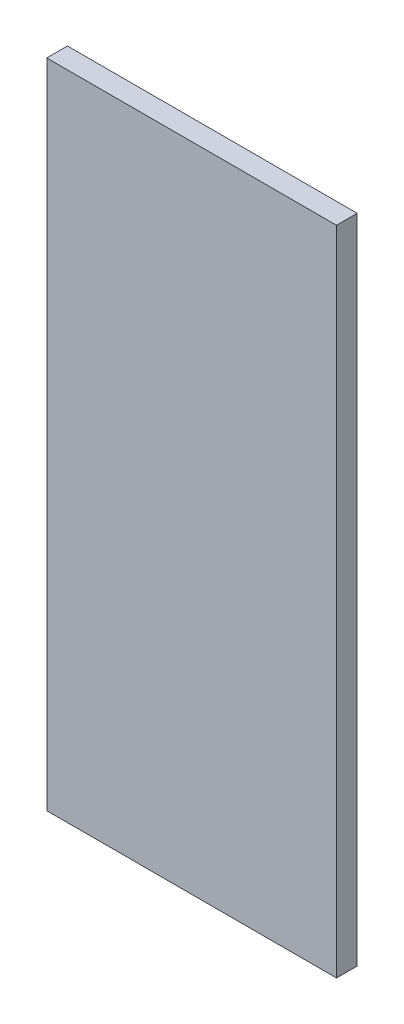
ISO-10303-21;
HEADER;
FILE_DESCRIPTION(('STEP AP214'),'2;1');
FILE_NAME('part.step','',(''),(''),'','','');
FILE_SCHEMA(('AUTOMOTIVE_DESIGN { 1 0 10303 214 1 1 1 1 }'));
ENDSEC;
DATA;
#1=APPLICATION_CONTEXT('core data for automotive mechanical design processes');
#2=APPLICATION_PROTOCOL_DEFINITION('international standard','automotive_design',2000,#1);
#3=PRODUCT_CONTEXT('',#1,'mechanical');
#4=PRODUCT('Part','Part','',(#3));
#5=PRODUCT_RELATED_PRODUCT_CATEGORY('part','',(#4));
#6=PRODUCT_DEFINITION_FORMATION('','',#4);
#7=PRODUCT_DEFINITION_CONTEXT('part definition',#1,'design');
#8=PRODUCT_DEFINITION('design','',#6,#7);
#9=PRODUCT_DEFINITION_SHAPE('','',#8);
#10=(LENGTH_UNIT() NAMED_UNIT(*) SI_UNIT(.MILLI.,.METRE.));
#11=(NAMED_UNIT(*) PLANE_ANGLE_UNIT() SI_UNIT($,.RADIAN.));
#12=(NAMED_UNIT(*) SI_UNIT($,.STERADIAN.) SOLID_ANGLE_UNIT());
#13=UNCERTAINTY_MEASURE_WITH_UNIT(LENGTH_MEASURE(1.E-05),#10,'distance_accuracy_value','');
#14=(GEOMETRIC_REPRESENTATION_CONTEXT(3) GLOBAL_UNCERTAINTY_ASSIGNED_CONTEXT((#13)) GLOBAL_UNIT_ASSIGNED_CONTEXT((#10,
#11,#12)) REPRESENTATION_CONTEXT('',''));
#15=CARTESIAN_POINT('',(0.,0.,0.));
#16=DIRECTION('',(0.,0.,1.));
#17=DIRECTION('',(1.,0.,0.));
#18=AXIS2_PLACEMENT_3D('',#15,#16,#17);
#19=CARTESIAN_POINT('',(0.,0.,6.35));
#20=DIRECTION('',(1.,0.,0.));
#21=DIRECTION('',(0.,0.,-1.));
#22=AXIS2_PLACEMENT_3D('',#19,#20,#21);
#23=PLANE('',#22);
#24=DIRECTION('',(0.,-1.,0.));
#25=VECTOR('',#24,1.);
#26=CARTESIAN_POINT('',(0.,0.,0.));
#27=LINE('',#26,#25);
#28=CARTESIAN_POINT('',(0.,200.,0.));
#29=VERTEX_POINT('',#28);
#30=CARTESIAN_POINT('',(0.,0.,0.));
#31=VERTEX_POINT('',#30);
#32=EDGE_CURVE('E96',#29,#31,#27,.T.);
#33=ORIENTED_EDGE('',*,*,#32,.T.);
#34=DIRECTION('',(0.,0.,-1.));
#35=VECTOR('',#34,1.);
#36=CARTESIAN_POINT('',(0.,0.,6.35));
#37=LINE('',#36,#35);
#38=CARTESIAN_POINT('',(0.,0.,6.35));
#39=VERTEX_POINT('',#38);
#40=EDGE_CURVE('E11',#39,#31,#37,.T.);
#41=ORIENTED_EDGE('',*,*,#40,.F.);
#42=DIRECTION('',(0.,-1.,0.));
#43=VECTOR('',#42,1.);
#44=CARTESIAN_POINT('',(0.,0.,6.35));
#45=LINE('',#44,#43);
#46=CARTESIAN_POINT('',(0.,200.,6.35));
#47=VERTEX_POINT('',#46);
#48=EDGE_CURVE('E84',#47,#39,#45,.T.);
#49=ORIENTED_EDGE('',*,*,#48,.F.);
#50=DIRECTION('',(0.,0.,-1.));
#51=VECTOR('',#50,1.);
#52=CARTESIAN_POINT('',(0.,200.,6.35));
#53=LINE('',#52,#51);
#54=EDGE_CURVE('E92',#47,#29,#53,.T.);
#55=ORIENTED_EDGE('',*,*,#54,.T.);
#56=EDGE_LOOP('',(#33,#41,#49,#55));
#57=FACE_BOUND('',#56,.T.);
#58=ADVANCED_FACE('F33',(#57),#23,.F.);
#59=CARTESIAN_POINT('',(0.,0.,6.35));
#60=DIRECTION('',(0.,1.,0.));
#61=DIRECTION('',(0.,0.,1.));
#62=AXIS2_PLACEMENT_3D('',#59,#60,#61);
#63=PLANE('',#62);
#64=DIRECTION('',(1.,0.,0.));
#65=VECTOR('',#64,1.);
#66=CARTESIAN_POINT('',(0.,0.,0.));
#67=LINE('',#66,#65);
#68=CARTESIAN_POINT('',(88.9,0.,0.));
#69=VERTEX_POINT('',#68);
#70=EDGE_CURVE('E88',#31,#69,#67,.T.);
#71=ORIENTED_EDGE('',*,*,#70,.T.);
#72=DIRECTION('',(0.,0.,-1.));
#73=VECTOR('',#72,1.);
#74=CARTESIAN_POINT('',(88.9,0.,6.35));
#75=LINE('',#74,#73);
#76=CARTESIAN_POINT('',(88.9,0.,6.35));
#77=VERTEX_POINT('',#76);
#78=EDGE_CURVE('E41',#77,#69,#75,.T.);
#79=ORIENTED_EDGE('',*,*,#78,.F.);
#80=DIRECTION('',(1.,0.,0.));
#81=VECTOR('',#80,1.);
#82=CARTESIAN_POINT('',(0.,0.,6.35));
#83=LINE('',#82,#81);
#84=EDGE_CURVE('E79',#39,#77,#83,.T.);
#85=ORIENTED_EDGE('',*,*,#84,.F.);
#86=ORIENTED_EDGE('',*,*,#40,.T.);
#87=EDGE_LOOP('',(#71,#79,#85,#86));
#88=FACE_BOUND('',#87,.T.);
#89=ADVANCED_FACE('F87',(#88),#63,.F.);
#90=CARTESIAN_POINT('',(88.9,0.,6.35));
#91=DIRECTION('',(-1.,0.,0.));
#92=DIRECTION('',(0.,0.,1.));
#93=AXIS2_PLACEMENT_3D('',#90,#91,#92);
#94=PLANE('',#93);
#95=DIRECTION('',(0.,1.,0.));
#96=VECTOR('',#95,1.);
#97=CARTESIAN_POINT('',(88.9,0.,0.));
#98=LINE('',#97,#96);
#99=CARTESIAN_POINT('',(88.9,200.,0.));
#100=VERTEX_POINT('',#99);
#101=EDGE_CURVE('E66',#69,#100,#98,.T.);
#102=ORIENTED_EDGE('',*,*,#101,.T.);
#103=DIRECTION('',(0.,0.,-1.));
#104=VECTOR('',#103,1.);
#105=CARTESIAN_POINT('',(88.9,200.,6.35));
#106=LINE('',#105,#104);
#107=CARTESIAN_POINT('',(88.9,200.,6.35));
#108=VERTEX_POINT('',#107);
#109=EDGE_CURVE('E89',#108,#100,#106,.T.);
#110=ORIENTED_EDGE('',*,*,#109,.F.);
#111=DIRECTION('',(0.,1.,0.));
#112=VECTOR('',#111,1.);
#113=CARTESIAN_POINT('',(88.9,0.,6.35));
#114=LINE('',#113,#112);
#115=EDGE_CURVE('E82',#77,#108,#114,.T.);
#116=ORIENTED_EDGE('',*,*,#115,.F.);
#117=ORIENTED_EDGE('',*,*,#78,.T.);
#118=EDGE_LOOP('',(#102,#110,#116,#117));
#119=FACE_BOUND('',#118,.T.);
#120=ADVANCED_FACE('F90',(#119),#94,.F.);
#121=CARTESIAN_POINT('',(0.,200.,6.35));
#122=DIRECTION('',(0.,-1.,0.));
#123=DIRECTION('',(0.,0.,-1.));
#124=AXIS2_PLACEMENT_3D('',#121,#122,#123);
#125=PLANE('',#124);
#126=DIRECTION('',(-1.,0.,0.));
#127=VECTOR('',#126,1.);
#128=CARTESIAN_POINT('',(0.,200.,0.));
#129=LINE('',#128,#127);
#130=EDGE_CURVE('E72',#100,#29,#129,.T.);
#131=ORIENTED_EDGE('',*,*,#130,.T.);
#132=ORIENTED_EDGE('',*,*,#54,.F.);
#133=DIRECTION('',(-1.,0.,0.));
#134=VECTOR('',#133,1.);
#135=CARTESIAN_POINT('',(0.,200.,6.35));
#136=LINE('',#135,#134);
#137=EDGE_CURVE('E49',#108,#47,#136,.T.);
#138=ORIENTED_EDGE('',*,*,#137,.F.);
#139=ORIENTED_EDGE('',*,*,#109,.T.);
#140=EDGE_LOOP('',(#131,#132,#138,#139));
#141=FACE_BOUND('',#140,.T.);
#142=ADVANCED_FACE('F103',(#141),#125,.F.);
#143=CARTESIAN_POINT('',(0.,0.,6.35));
#144=DIRECTION('',(0.,0.,-1.));
#145=DIRECTION('',(-1.,0.,0.));
#146=AXIS2_PLACEMENT_3D('',#143,#144,#145);
#147=PLANE('',#146);
#148=ORIENTED_EDGE('',*,*,#48,.T.);
#149=ORIENTED_EDGE('',*,*,#84,.T.);
#150=ORIENTED_EDGE('',*,*,#115,.T.);
#151=ORIENTED_EDGE('',*,*,#137,.T.);
#152=EDGE_LOOP('',(#148,#149,#150,#151));
#153=FACE_BOUND('',#152,.T.);
#154=ADVANCED_FACE('F80',(#153),#147,.F.);
#155=CARTESIAN_POINT('',(0.,0.,0.));
#156=DIRECTION('',(0.,0.,-1.));
#157=DIRECTION('',(-1.,0.,0.));
#158=AXIS2_PLACEMENT_3D('',#155,#156,#157);
#159=PLANE('',#158);
#160=ORIENTED_EDGE('',*,*,#32,.F.);
#161=ORIENTED_EDGE('',*,*,#130,.F.);
#162=ORIENTED_EDGE('',*,*,#101,.F.);
#163=ORIENTED_EDGE('',*,*,#70,.F.);
#164=EDGE_LOOP('',(#160,#161,#162,#163));
#165=FACE_BOUND('',#164,.T.);
#166=ADVANCED_FACE('F106',(#165),#159,.T.);
#167=CLOSED_SHELL('',(#58,#89,#120,#142,#154,#166));
#168=MANIFOLD_SOLID_BREP('B2',#167);
#169=ADVANCED_BREP_SHAPE_REPRESENTATION('',(#18,#168),#14);
#170=SHAPE_DEFINITION_REPRESENTATION(#9,#169);
ENDSEC;
END-ISO-10303-21;
